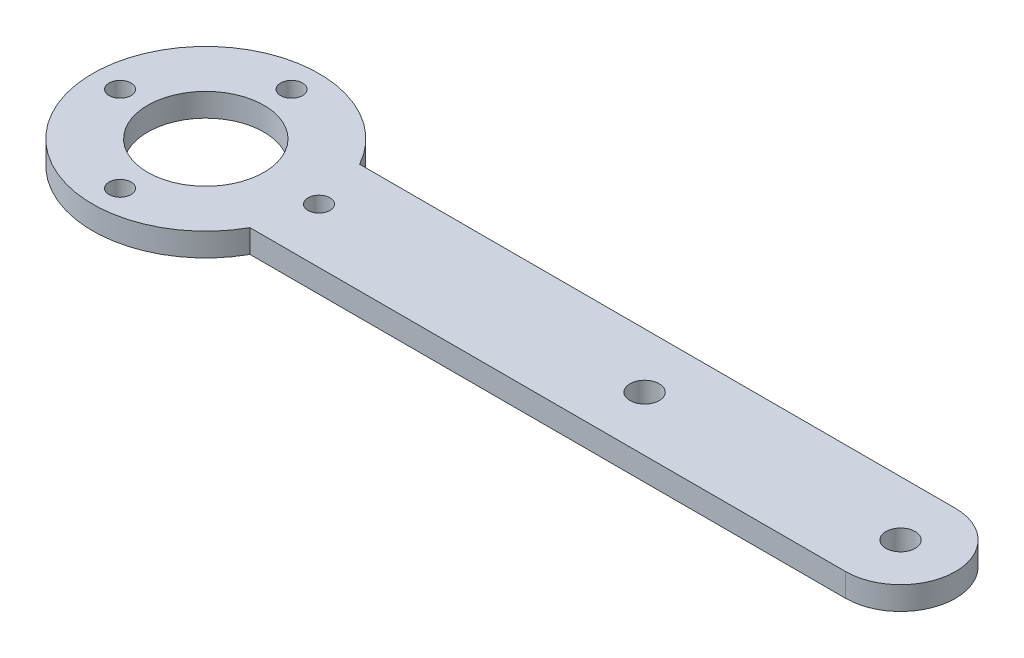
ISO-10303-21;
HEADER;
FILE_DESCRIPTION(('STEP AP214'),'2;1');
FILE_NAME('part.step','',(''),(''),'','','');
FILE_SCHEMA(('AUTOMOTIVE_DESIGN { 1 0 10303 214 1 1 1 1 }'));
ENDSEC;
DATA;
#1=APPLICATION_CONTEXT('core data for automotive mechanical design processes');
#2=APPLICATION_PROTOCOL_DEFINITION('international standard','automotive_design',2000,#1);
#3=PRODUCT_CONTEXT('',#1,'mechanical');
#4=PRODUCT('Part','Part','',(#3));
#5=PRODUCT_RELATED_PRODUCT_CATEGORY('part','',(#4));
#6=PRODUCT_DEFINITION_FORMATION('','',#4);
#7=PRODUCT_DEFINITION_CONTEXT('part definition',#1,'design');
#8=PRODUCT_DEFINITION('design','',#6,#7);
#9=PRODUCT_DEFINITION_SHAPE('','',#8);
#10=(LENGTH_UNIT() NAMED_UNIT(*) SI_UNIT(.MILLI.,.METRE.));
#11=(NAMED_UNIT(*) PLANE_ANGLE_UNIT() SI_UNIT($,.RADIAN.));
#12=(NAMED_UNIT(*) SI_UNIT($,.STERADIAN.) SOLID_ANGLE_UNIT());
#13=UNCERTAINTY_MEASURE_WITH_UNIT(LENGTH_MEASURE(1.E-05),#10,'distance_accuracy_value','');
#14=(GEOMETRIC_REPRESENTATION_CONTEXT(3) GLOBAL_UNCERTAINTY_ASSIGNED_CONTEXT((#13)) GLOBAL_UNIT_ASSIGNED_CONTEXT((#10,
#11,#12)) REPRESENTATION_CONTEXT('',''));
#15=CARTESIAN_POINT('',(0.,0.,0.));
#16=DIRECTION('',(0.,0.,1.));
#17=DIRECTION('',(1.,0.,0.));
#18=AXIS2_PLACEMENT_3D('',#15,#16,#17);
#19=CARTESIAN_POINT('',(0.,3.175,0.));
#20=DIRECTION('',(0.,1.,0.));
#21=DIRECTION('',(0.,0.,1.));
#22=AXIS2_PLACEMENT_3D('',#19,#20,#21);
#23=PLANE('',#22);
#24=CARTESIAN_POINT('',(0.,3.175,-11.725));
#25=DIRECTION('',(0.,1.,0.));
#26=DIRECTION('',(0.,0.,1.));
#27=AXIS2_PLACEMENT_3D('',#24,#25,#26);
#28=CIRCLE('',#27,1.5);
#29=CARTESIAN_POINT('',(0.,3.175,-10.225));
#30=VERTEX_POINT('',#29);
#31=EDGE_CURVE('E138',#30,#30,#28,.T.);
#32=ORIENTED_EDGE('',*,*,#31,.F.);
#33=EDGE_LOOP('',(#32));
#34=FACE_BOUND('',#33,.T.);
#35=CARTESIAN_POINT('',(95.,3.175,0.));
#36=DIRECTION('',(0.,1.,0.));
#37=DIRECTION('',(0.,0.,1.));
#38=AXIS2_PLACEMENT_3D('',#35,#36,#37);
#39=CIRCLE('',#38,2.);
#40=CARTESIAN_POINT('',(95.,3.175,2.));
#41=VERTEX_POINT('',#40);
#42=EDGE_CURVE('E126',#41,#41,#39,.T.);
#43=ORIENTED_EDGE('',*,*,#42,.F.);
#44=EDGE_LOOP('',(#43));
#45=FACE_BOUND('',#44,.T.);
#46=CARTESIAN_POINT('',(-11.725,3.175,0.));
#47=DIRECTION('',(0.,1.,0.));
#48=DIRECTION('',(0.,0.,1.));
#49=AXIS2_PLACEMENT_3D('',#46,#47,#48);
#50=CIRCLE('',#49,1.5);
#51=CARTESIAN_POINT('',(-11.725,3.175,1.5));
#52=VERTEX_POINT('',#51);
#53=EDGE_CURVE('E114',#52,#52,#50,.T.);
#54=ORIENTED_EDGE('',*,*,#53,.F.);
#55=EDGE_LOOP('',(#54));
#56=FACE_BOUND('',#55,.T.);
#57=CARTESIAN_POINT('',(0.,3.175,0.));
#58=DIRECTION('',(0.,1.,0.));
#59=DIRECTION('',(0.,0.,1.));
#60=AXIS2_PLACEMENT_3D('',#57,#58,#59);
#61=CIRCLE('',#60,15.475);
#62=CARTESIAN_POINT('',(13.5360860295729,3.175,-7.50000000000001));
#63=VERTEX_POINT('',#62);
#64=CARTESIAN_POINT('',(13.5360860295729,3.175,7.50000000000001));
#65=VERTEX_POINT('',#64);
#66=EDGE_CURVE('E84',#63,#65,#61,.T.);
#67=ORIENTED_EDGE('',*,*,#66,.T.);
#68=DIRECTION('',(1.,0.,0.));
#69=VECTOR('',#68,1.);
#70=CARTESIAN_POINT('',(95.,3.175,7.5));
#71=LINE('',#70,#69);
#72=CARTESIAN_POINT('',(95.,3.175,7.5));
#73=VERTEX_POINT('',#72);
#74=EDGE_CURVE('E79',#65,#73,#71,.T.);
#75=ORIENTED_EDGE('',*,*,#74,.T.);
#76=CARTESIAN_POINT('',(95.,3.175,0.));
#77=DIRECTION('',(0.,1.,0.));
#78=DIRECTION('',(0.,0.,1.));
#79=AXIS2_PLACEMENT_3D('',#76,#77,#78);
#80=CIRCLE('',#79,7.5);
#81=CARTESIAN_POINT('',(95.,3.175,-7.5));
#82=VERTEX_POINT('',#81);
#83=EDGE_CURVE('E82',#73,#82,#80,.T.);
#84=ORIENTED_EDGE('',*,*,#83,.T.);
#85=DIRECTION('',(-1.,0.,0.));
#86=VECTOR('',#85,1.);
#87=CARTESIAN_POINT('',(13.5360860295729,3.175,-7.50000000000001));
#88=LINE('',#87,#86);
#89=EDGE_CURVE('E49',#82,#63,#88,.T.);
#90=ORIENTED_EDGE('',*,*,#89,.T.);
#91=EDGE_LOOP('',(#67,#75,#84,#90));
#92=FACE_BOUND('',#91,.T.);
#93=CARTESIAN_POINT('',(0.,3.175,0.));
#94=DIRECTION('',(0.,1.,0.));
#95=DIRECTION('',(0.,0.,1.));
#96=AXIS2_PLACEMENT_3D('',#93,#94,#95);
#97=CIRCLE('',#96,7.95);
#98=CARTESIAN_POINT('',(0.,3.175,7.95));
#99=VERTEX_POINT('',#98);
#100=EDGE_CURVE('E99',#99,#99,#97,.T.);
#101=ORIENTED_EDGE('',*,*,#100,.F.);
#102=EDGE_LOOP('',(#101));
#103=FACE_BOUND('',#102,.T.);
#104=CARTESIAN_POINT('',(60.,3.175,0.));
#105=DIRECTION('',(0.,1.,0.));
#106=DIRECTION('',(0.,0.,1.));
#107=AXIS2_PLACEMENT_3D('',#104,#105,#106);
#108=CIRCLE('',#107,2.);
#109=CARTESIAN_POINT('',(60.,3.175,2.));
#110=VERTEX_POINT('',#109);
#111=EDGE_CURVE('E120',#110,#110,#108,.T.);
#112=ORIENTED_EDGE('',*,*,#111,.F.);
#113=EDGE_LOOP('',(#112));
#114=FACE_BOUND('',#113,.T.);
#115=CARTESIAN_POINT('',(0.,3.175,11.725));
#116=DIRECTION('',(0.,1.,0.));
#117=DIRECTION('',(0.,0.,1.));
#118=AXIS2_PLACEMENT_3D('',#115,#116,#117);
#119=CIRCLE('',#118,1.5);
#120=CARTESIAN_POINT('',(0.,3.175,13.225));
#121=VERTEX_POINT('',#120);
#122=EDGE_CURVE('E132',#121,#121,#119,.T.);
#123=ORIENTED_EDGE('',*,*,#122,.F.);
#124=EDGE_LOOP('',(#123));
#125=FACE_BOUND('',#124,.T.);
#126=CARTESIAN_POINT('',(15.475,3.175,0.));
#127=DIRECTION('',(0.,1.,0.));
#128=DIRECTION('',(0.,0.,1.));
#129=AXIS2_PLACEMENT_3D('',#126,#127,#128);
#130=CIRCLE('',#129,1.5);
#131=CARTESIAN_POINT('',(15.475,3.175,1.5));
#132=VERTEX_POINT('',#131);
#133=EDGE_CURVE('E144',#132,#132,#130,.T.);
#134=ORIENTED_EDGE('',*,*,#133,.F.);
#135=EDGE_LOOP('',(#134));
#136=FACE_BOUND('',#135,.T.);
#137=ADVANCED_FACE('F32',(#34,#45,#56,#92,#103,#114,#125,#136),#23,.T.);
#138=CARTESIAN_POINT('',(0.,0.,0.));
#139=DIRECTION('',(0.,1.,0.));
#140=DIRECTION('',(0.,0.,1.));
#141=AXIS2_PLACEMENT_3D('',#138,#139,#140);
#142=PLANE('',#141);
#143=CARTESIAN_POINT('',(0.,0.,0.));
#144=DIRECTION('',(0.,1.,0.));
#145=DIRECTION('',(0.,0.,1.));
#146=AXIS2_PLACEMENT_3D('',#143,#144,#145);
#147=CIRCLE('',#146,15.475);
#148=CARTESIAN_POINT('',(13.5360860295729,0.,-7.50000000000001));
#149=VERTEX_POINT('',#148);
#150=CARTESIAN_POINT('',(13.5360860295729,0.,7.50000000000001));
#151=VERTEX_POINT('',#150);
#152=EDGE_CURVE('E96',#149,#151,#147,.T.);
#153=ORIENTED_EDGE('',*,*,#152,.F.);
#154=DIRECTION('',(-1.,0.,0.));
#155=VECTOR('',#154,1.);
#156=CARTESIAN_POINT('',(13.5360860295729,0.,-7.50000000000001));
#157=LINE('',#156,#155);
#158=CARTESIAN_POINT('',(95.,0.,-7.5));
#159=VERTEX_POINT('',#158);
#160=EDGE_CURVE('E72',#159,#149,#157,.T.);
#161=ORIENTED_EDGE('',*,*,#160,.F.);
#162=CARTESIAN_POINT('',(95.,0.,0.));
#163=DIRECTION('',(0.,1.,0.));
#164=DIRECTION('',(0.,0.,1.));
#165=AXIS2_PLACEMENT_3D('',#162,#163,#164);
#166=CIRCLE('',#165,7.5);
#167=CARTESIAN_POINT('',(95.,0.,7.5));
#168=VERTEX_POINT('',#167);
#169=EDGE_CURVE('E66',#168,#159,#166,.T.);
#170=ORIENTED_EDGE('',*,*,#169,.F.);
#171=DIRECTION('',(1.,0.,0.));
#172=VECTOR('',#171,1.);
#173=CARTESIAN_POINT('',(95.,0.,7.5));
#174=LINE('',#173,#172);
#175=EDGE_CURVE('E88',#151,#168,#174,.T.);
#176=ORIENTED_EDGE('',*,*,#175,.F.);
#177=EDGE_LOOP('',(#153,#161,#170,#176));
#178=FACE_BOUND('',#177,.T.);
#179=CARTESIAN_POINT('',(0.,0.,0.));
#180=DIRECTION('',(0.,1.,0.));
#181=DIRECTION('',(0.,0.,1.));
#182=AXIS2_PLACEMENT_3D('',#179,#180,#181);
#183=CIRCLE('',#182,7.95);
#184=CARTESIAN_POINT('',(0.,0.,7.95));
#185=VERTEX_POINT('',#184);
#186=EDGE_CURVE('E111',#185,#185,#183,.T.);
#187=ORIENTED_EDGE('',*,*,#186,.T.);
#188=EDGE_LOOP('',(#187));
#189=FACE_BOUND('',#188,.T.);
#190=CARTESIAN_POINT('',(-11.725,0.,0.));
#191=DIRECTION('',(0.,1.,0.));
#192=DIRECTION('',(0.,0.,1.));
#193=AXIS2_PLACEMENT_3D('',#190,#191,#192);
#194=CIRCLE('',#193,1.5);
#195=CARTESIAN_POINT('',(-11.725,0.,1.5));
#196=VERTEX_POINT('',#195);
#197=EDGE_CURVE('E117',#196,#196,#194,.T.);
#198=ORIENTED_EDGE('',*,*,#197,.T.);
#199=EDGE_LOOP('',(#198));
#200=FACE_BOUND('',#199,.T.);
#201=CARTESIAN_POINT('',(60.,0.,0.));
#202=DIRECTION('',(0.,1.,0.));
#203=DIRECTION('',(0.,0.,1.));
#204=AXIS2_PLACEMENT_3D('',#201,#202,#203);
#205=CIRCLE('',#204,2.);
#206=CARTESIAN_POINT('',(60.,0.,2.));
#207=VERTEX_POINT('',#206);
#208=EDGE_CURVE('E123',#207,#207,#205,.T.);
#209=ORIENTED_EDGE('',*,*,#208,.T.);
#210=EDGE_LOOP('',(#209));
#211=FACE_BOUND('',#210,.T.);
#212=CARTESIAN_POINT('',(95.,0.,0.));
#213=DIRECTION('',(0.,1.,0.));
#214=DIRECTION('',(0.,0.,1.));
#215=AXIS2_PLACEMENT_3D('',#212,#213,#214);
#216=CIRCLE('',#215,2.);
#217=CARTESIAN_POINT('',(95.,0.,2.));
#218=VERTEX_POINT('',#217);
#219=EDGE_CURVE('E129',#218,#218,#216,.T.);
#220=ORIENTED_EDGE('',*,*,#219,.T.);
#221=EDGE_LOOP('',(#220));
#222=FACE_BOUND('',#221,.T.);
#223=CARTESIAN_POINT('',(0.,0.,11.725));
#224=DIRECTION('',(0.,1.,0.));
#225=DIRECTION('',(0.,0.,1.));
#226=AXIS2_PLACEMENT_3D('',#223,#224,#225);
#227=CIRCLE('',#226,1.5);
#228=CARTESIAN_POINT('',(0.,0.,13.225));
#229=VERTEX_POINT('',#228);
#230=EDGE_CURVE('E135',#229,#229,#227,.T.);
#231=ORIENTED_EDGE('',*,*,#230,.T.);
#232=EDGE_LOOP('',(#231));
#233=FACE_BOUND('',#232,.T.);
#234=CARTESIAN_POINT('',(0.,0.,-11.725));
#235=DIRECTION('',(0.,1.,0.));
#236=DIRECTION('',(0.,0.,1.));
#237=AXIS2_PLACEMENT_3D('',#234,#235,#236);
#238=CIRCLE('',#237,1.5);
#239=CARTESIAN_POINT('',(0.,0.,-10.225));
#240=VERTEX_POINT('',#239);
#241=EDGE_CURVE('E141',#240,#240,#238,.T.);
#242=ORIENTED_EDGE('',*,*,#241,.T.);
#243=EDGE_LOOP('',(#242));
#244=FACE_BOUND('',#243,.T.);
#245=CARTESIAN_POINT('',(15.475,0.,0.));
#246=DIRECTION('',(0.,1.,0.));
#247=DIRECTION('',(0.,0.,1.));
#248=AXIS2_PLACEMENT_3D('',#245,#246,#247);
#249=CIRCLE('',#248,1.5);
#250=CARTESIAN_POINT('',(15.475,0.,1.5));
#251=VERTEX_POINT('',#250);
#252=EDGE_CURVE('E147',#251,#251,#249,.T.);
#253=ORIENTED_EDGE('',*,*,#252,.T.);
#254=EDGE_LOOP('',(#253));
#255=FACE_BOUND('',#254,.T.);
#256=ADVANCED_FACE('F107',(#178,#189,#200,#211,#222,#233,#244,#255),#142,.F.);
#257=CARTESIAN_POINT('',(0.,3.175,0.));
#258=DIRECTION('',(0.,-1.,0.));
#259=DIRECTION('',(0.,0.,-1.));
#260=AXIS2_PLACEMENT_3D('',#257,#258,#259);
#261=CYLINDRICAL_SURFACE('',#260,15.475);
#262=ORIENTED_EDGE('',*,*,#152,.T.);
#263=DIRECTION('',(0.,-1.,0.));
#264=VECTOR('',#263,1.);
#265=CARTESIAN_POINT('',(13.5360860295729,3.175,7.50000000000001));
#266=LINE('',#265,#264);
#267=EDGE_CURVE('E11',#65,#151,#266,.T.);
#268=ORIENTED_EDGE('',*,*,#267,.F.);
#269=ORIENTED_EDGE('',*,*,#66,.F.);
#270=DIRECTION('',(0.,-1.,0.));
#271=VECTOR('',#270,1.);
#272=CARTESIAN_POINT('',(13.5360860295729,3.175,-7.50000000000001));
#273=LINE('',#272,#271);
#274=EDGE_CURVE('E92',#63,#149,#273,.T.);
#275=ORIENTED_EDGE('',*,*,#274,.T.);
#276=EDGE_LOOP('',(#262,#268,#269,#275));
#277=FACE_BOUND('',#276,.T.);
#278=ADVANCED_FACE('F34',(#277),#261,.T.);
#279=CARTESIAN_POINT('',(95.,3.175,7.5));
#280=DIRECTION('',(0.,0.,-1.));
#281=DIRECTION('',(-1.,0.,0.));
#282=AXIS2_PLACEMENT_3D('',#279,#280,#281);
#283=PLANE('',#282);
#284=ORIENTED_EDGE('',*,*,#175,.T.);
#285=DIRECTION('',(0.,-1.,0.));
#286=VECTOR('',#285,1.);
#287=CARTESIAN_POINT('',(95.,3.175,7.5));
#288=LINE('',#287,#286);
#289=EDGE_CURVE('E41',#73,#168,#288,.T.);
#290=ORIENTED_EDGE('',*,*,#289,.F.);
#291=ORIENTED_EDGE('',*,*,#74,.F.);
#292=ORIENTED_EDGE('',*,*,#267,.T.);
#293=EDGE_LOOP('',(#284,#290,#291,#292));
#294=FACE_BOUND('',#293,.T.);
#295=ADVANCED_FACE('F87',(#294),#283,.F.);
#296=CARTESIAN_POINT('',(95.,3.175,0.));
#297=DIRECTION('',(0.,-1.,0.));
#298=DIRECTION('',(0.,0.,-1.));
#299=AXIS2_PLACEMENT_3D('',#296,#297,#298);
#300=CYLINDRICAL_SURFACE('',#299,7.5);
#301=ORIENTED_EDGE('',*,*,#169,.T.);
#302=DIRECTION('',(0.,-1.,0.));
#303=VECTOR('',#302,1.);
#304=CARTESIAN_POINT('',(95.,3.175,-7.5));
#305=LINE('',#304,#303);
#306=EDGE_CURVE('E89',#82,#159,#305,.T.);
#307=ORIENTED_EDGE('',*,*,#306,.F.);
#308=ORIENTED_EDGE('',*,*,#83,.F.);
#309=ORIENTED_EDGE('',*,*,#289,.T.);
#310=EDGE_LOOP('',(#301,#307,#308,#309));
#311=FACE_BOUND('',#310,.T.);
#312=ADVANCED_FACE('F90',(#311),#300,.T.);
#313=CARTESIAN_POINT('',(13.5360860295729,3.175,-7.50000000000001));
#314=DIRECTION('',(0.,0.,1.));
#315=DIRECTION('',(1.,0.,0.));
#316=AXIS2_PLACEMENT_3D('',#313,#314,#315);
#317=PLANE('',#316);
#318=ORIENTED_EDGE('',*,*,#160,.T.);
#319=ORIENTED_EDGE('',*,*,#274,.F.);
#320=ORIENTED_EDGE('',*,*,#89,.F.);
#321=ORIENTED_EDGE('',*,*,#306,.T.);
#322=EDGE_LOOP('',(#318,#319,#320,#321));
#323=FACE_BOUND('',#322,.T.);
#324=ADVANCED_FACE('F104',(#323),#317,.F.);
#325=CARTESIAN_POINT('',(0.,3.175,0.));
#326=DIRECTION('',(0.,-1.,0.));
#327=DIRECTION('',(0.,0.,-1.));
#328=AXIS2_PLACEMENT_3D('',#325,#326,#327);
#329=CYLINDRICAL_SURFACE('',#328,7.95);
#330=ORIENTED_EDGE('',*,*,#100,.T.);
#331=EDGE_LOOP('',(#330));
#332=FACE_BOUND('',#331,.T.);
#333=ORIENTED_EDGE('',*,*,#186,.F.);
#334=EDGE_LOOP('',(#333));
#335=FACE_BOUND('',#334,.T.);
#336=ADVANCED_FACE('F166',(#332,#335),#329,.F.);
#337=CARTESIAN_POINT('',(-11.725,3.175,0.));
#338=DIRECTION('',(0.,-1.,0.));
#339=DIRECTION('',(0.,0.,-1.));
#340=AXIS2_PLACEMENT_3D('',#337,#338,#339);
#341=CYLINDRICAL_SURFACE('',#340,1.5);
#342=ORIENTED_EDGE('',*,*,#53,.T.);
#343=EDGE_LOOP('',(#342));
#344=FACE_BOUND('',#343,.T.);
#345=ORIENTED_EDGE('',*,*,#197,.F.);
#346=EDGE_LOOP('',(#345));
#347=FACE_BOUND('',#346,.T.);
#348=ADVANCED_FACE('F212',(#344,#347),#341,.F.);
#349=CARTESIAN_POINT('',(60.,3.175,0.));
#350=DIRECTION('',(0.,-1.,0.));
#351=DIRECTION('',(0.,0.,-1.));
#352=AXIS2_PLACEMENT_3D('',#349,#350,#351);
#353=CYLINDRICAL_SURFACE('',#352,2.);
#354=ORIENTED_EDGE('',*,*,#111,.T.);
#355=EDGE_LOOP('',(#354));
#356=FACE_BOUND('',#355,.T.);
#357=ORIENTED_EDGE('',*,*,#208,.F.);
#358=EDGE_LOOP('',(#357));
#359=FACE_BOUND('',#358,.T.);
#360=ADVANCED_FACE('F220',(#356,#359),#353,.F.);
#361=CARTESIAN_POINT('',(95.,3.175,0.));
#362=DIRECTION('',(0.,-1.,0.));
#363=DIRECTION('',(0.,0.,-1.));
#364=AXIS2_PLACEMENT_3D('',#361,#362,#363);
#365=CYLINDRICAL_SURFACE('',#364,2.);
#366=ORIENTED_EDGE('',*,*,#42,.T.);
#367=EDGE_LOOP('',(#366));
#368=FACE_BOUND('',#367,.T.);
#369=ORIENTED_EDGE('',*,*,#219,.F.);
#370=EDGE_LOOP('',(#369));
#371=FACE_BOUND('',#370,.T.);
#372=ADVANCED_FACE('F228',(#368,#371),#365,.F.);
#373=CARTESIAN_POINT('',(0.,3.175,11.725));
#374=DIRECTION('',(0.,-1.,0.));
#375=DIRECTION('',(0.,0.,-1.));
#376=AXIS2_PLACEMENT_3D('',#373,#374,#375);
#377=CYLINDRICAL_SURFACE('',#376,1.5);
#378=ORIENTED_EDGE('',*,*,#122,.T.);
#379=EDGE_LOOP('',(#378));
#380=FACE_BOUND('',#379,.T.);
#381=ORIENTED_EDGE('',*,*,#230,.F.);
#382=EDGE_LOOP('',(#381));
#383=FACE_BOUND('',#382,.T.);
#384=ADVANCED_FACE('F237',(#380,#383),#377,.F.);
#385=CARTESIAN_POINT('',(0.,3.175,-11.725));
#386=DIRECTION('',(0.,-1.,0.));
#387=DIRECTION('',(0.,0.,-1.));
#388=AXIS2_PLACEMENT_3D('',#385,#386,#387);
#389=CYLINDRICAL_SURFACE('',#388,1.5);
#390=ORIENTED_EDGE('',*,*,#31,.T.);
#391=EDGE_LOOP('',(#390));
#392=FACE_BOUND('',#391,.T.);
#393=ORIENTED_EDGE('',*,*,#241,.F.);
#394=EDGE_LOOP('',(#393));
#395=FACE_BOUND('',#394,.T.);
#396=ADVANCED_FACE('F246',(#392,#395),#389,.F.);
#397=CARTESIAN_POINT('',(15.475,3.175,0.));
#398=DIRECTION('',(0.,-1.,0.));
#399=DIRECTION('',(0.,0.,-1.));
#400=AXIS2_PLACEMENT_3D('',#397,#398,#399);
#401=CYLINDRICAL_SURFACE('',#400,1.5);
#402=ORIENTED_EDGE('',*,*,#133,.T.);
#403=EDGE_LOOP('',(#402));
#404=FACE_BOUND('',#403,.T.);
#405=ORIENTED_EDGE('',*,*,#252,.F.);
#406=EDGE_LOOP('',(#405));
#407=FACE_BOUND('',#406,.T.);
#408=ADVANCED_FACE('F153',(#404,#407),#401,.F.);
#409=CLOSED_SHELL('',(#137,#256,#278,#295,#312,#324,#336,#348,#360,#372,#384,#396,#408));
#410=MANIFOLD_SOLID_BREP('B2',#409);
#411=ADVANCED_BREP_SHAPE_REPRESENTATION('',(#18,#410),#14);
#412=SHAPE_DEFINITION_REPRESENTATION(#9,#411);
ENDSEC;
END-ISO-10303-21;
